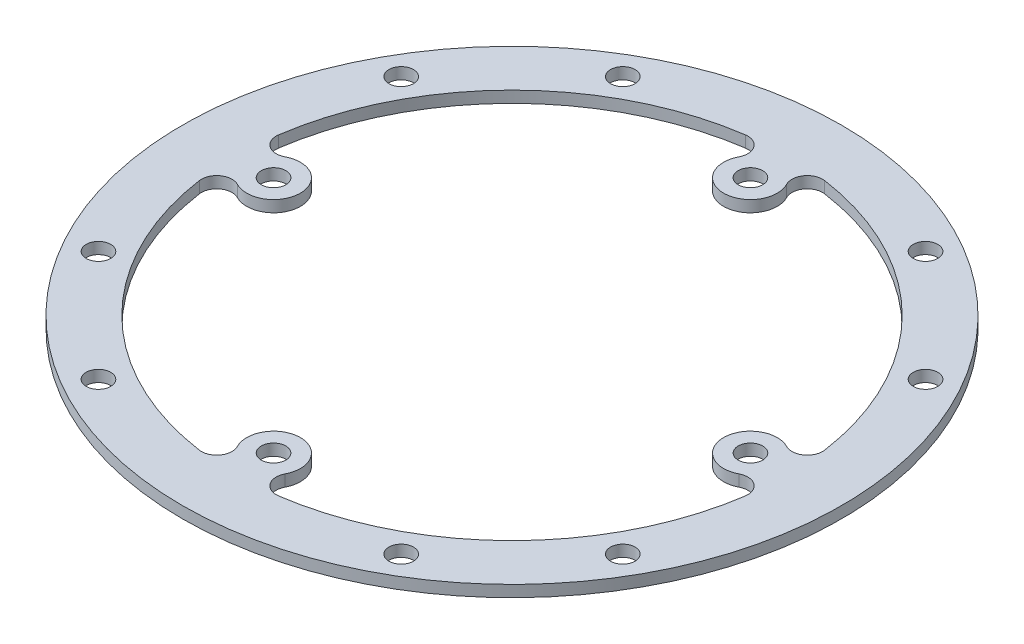
ISO-10303-21;
HEADER;
FILE_DESCRIPTION(('STEP AP214'),'2;1');
FILE_NAME('part.step','',(''),(''),'','','');
FILE_SCHEMA(('AUTOMOTIVE_DESIGN { 1 0 10303 214 1 1 1 1 }'));
ENDSEC;
DATA;
#1=APPLICATION_CONTEXT('core data for automotive mechanical design processes');
#2=APPLICATION_PROTOCOL_DEFINITION('international standard','automotive_design',2000,#1);
#3=PRODUCT_CONTEXT('',#1,'mechanical');
#4=PRODUCT('Part','Part','',(#3));
#5=PRODUCT_RELATED_PRODUCT_CATEGORY('part','',(#4));
#6=PRODUCT_DEFINITION_FORMATION('','',#4);
#7=PRODUCT_DEFINITION_CONTEXT('part definition',#1,'design');
#8=PRODUCT_DEFINITION('design','',#6,#7);
#9=PRODUCT_DEFINITION_SHAPE('','',#8);
#10=(LENGTH_UNIT() NAMED_UNIT(*) SI_UNIT(.MILLI.,.METRE.));
#11=(NAMED_UNIT(*) PLANE_ANGLE_UNIT() SI_UNIT($,.RADIAN.));
#12=(NAMED_UNIT(*) SI_UNIT($,.STERADIAN.) SOLID_ANGLE_UNIT());
#13=UNCERTAINTY_MEASURE_WITH_UNIT(LENGTH_MEASURE(1.E-05),#10,'distance_accuracy_value','');
#14=(GEOMETRIC_REPRESENTATION_CONTEXT(3) GLOBAL_UNCERTAINTY_ASSIGNED_CONTEXT((#13)) GLOBAL_UNIT_ASSIGNED_CONTEXT((#10,
#11,#12)) REPRESENTATION_CONTEXT('',''));
#15=CARTESIAN_POINT('',(0.,0.,0.));
#16=DIRECTION('',(0.,0.,1.));
#17=DIRECTION('',(1.,0.,0.));
#18=AXIS2_PLACEMENT_3D('',#15,#16,#17);
#19=CARTESIAN_POINT('',(0.,0.75,0.));
#20=DIRECTION('',(0.,-1.,0.));
#21=DIRECTION('',(0.,0.,-1.));
#22=AXIS2_PLACEMENT_3D('',#19,#20,#21);
#23=CYLINDRICAL_SURFACE('',#22,43.);
#24=CARTESIAN_POINT('',(0.,0.75,0.));
#25=DIRECTION('',(0.,1.,0.));
#26=DIRECTION('',(0.,0.,1.));
#27=AXIS2_PLACEMENT_3D('',#24,#25,#26);
#28=CIRCLE('',#27,43.);
#29=CARTESIAN_POINT('',(0.,0.75,43.));
#30=VERTEX_POINT('',#29);
#31=EDGE_CURVE('E11',#30,#30,#28,.T.);
#32=ORIENTED_EDGE('',*,*,#31,.F.);
#33=EDGE_LOOP('',(#32));
#34=FACE_BOUND('',#33,.T.);
#35=CARTESIAN_POINT('',(0.,-0.75,0.));
#36=DIRECTION('',(0.,1.,0.));
#37=DIRECTION('',(0.,0.,1.));
#38=AXIS2_PLACEMENT_3D('',#35,#36,#37);
#39=CIRCLE('',#38,43.);
#40=CARTESIAN_POINT('',(0.,-0.75,43.));
#41=VERTEX_POINT('',#40);
#42=EDGE_CURVE('E38',#41,#41,#39,.T.);
#43=ORIENTED_EDGE('',*,*,#42,.T.);
#44=EDGE_LOOP('',(#43));
#45=FACE_BOUND('',#44,.T.);
#46=ADVANCED_FACE('F35',(#34,#45),#23,.T.);
#47=CARTESIAN_POINT('',(0.,0.75,0.));
#48=DIRECTION('',(0.,1.,0.));
#49=DIRECTION('',(0.,0.,1.));
#50=AXIS2_PLACEMENT_3D('',#47,#48,#49);
#51=PLANE('',#50);
#52=CARTESIAN_POINT('',(-33.6478368888485,0.75,4.88088851557246));
#53=DIRECTION('',(0.,1.,0.));
#54=DIRECTION('',(0.,0.,1.));
#55=AXIS2_PLACEMENT_3D('',#52,#53,#54);
#56=CIRCLE('',#55,1.99999999999999);
#57=CARTESIAN_POINT('',(-32.7259683373429,0.75,3.1060199644552));
#58=VERTEX_POINT('',#57);
#59=CARTESIAN_POINT('',(-35.6271214117219,0.75,5.16799960472377));
#60=VERTEX_POINT('',#59);
#61=EDGE_CURVE('E49',#58,#60,#56,.T.);
#62=ORIENTED_EDGE('',*,*,#61,.F.);
#63=CARTESIAN_POINT('',(-31.1126983722082,0.75,0.));
#64=DIRECTION('',(0.,-1.,0.));
#65=DIRECTION('',(0.,0.,1.));
#66=AXIS2_PLACEMENT_3D('',#63,#64,#65);
#67=CIRCLE('',#66,3.5);
#68=CARTESIAN_POINT('',(-32.7259683373429,0.75,-3.1060199644552));
#69=VERTEX_POINT('',#68);
#70=EDGE_CURVE('E166',#69,#58,#67,.T.);
#71=ORIENTED_EDGE('',*,*,#70,.F.);
#72=CARTESIAN_POINT('',(-33.6478368888485,0.75,-4.88088851557246));
#73=DIRECTION('',(0.,1.,0.));
#74=DIRECTION('',(0.,0.,1.));
#75=AXIS2_PLACEMENT_3D('',#72,#73,#74);
#76=CIRCLE('',#75,2.);
#77=CARTESIAN_POINT('',(-35.6271214117219,0.75,-5.16799960472379));
#78=VERTEX_POINT('',#77);
#79=EDGE_CURVE('E169',#78,#69,#76,.T.);
#80=ORIENTED_EDGE('',*,*,#79,.F.);
#81=CARTESIAN_POINT('',(0.,0.75,0.));
#82=DIRECTION('',(0.,1.,0.));
#83=DIRECTION('',(0.,0.,1.));
#84=AXIS2_PLACEMENT_3D('',#81,#82,#83);
#85=CIRCLE('',#84,36.);
#86=CARTESIAN_POINT('',(-5.16799960472367,0.75,-35.627121411722));
#87=VERTEX_POINT('',#86);
#88=EDGE_CURVE('E245',#87,#78,#85,.T.);
#89=ORIENTED_EDGE('',*,*,#88,.F.);
#90=CARTESIAN_POINT('',(-4.88088851557246,0.75,-33.6478368888485));
#91=DIRECTION('',(0.,1.,0.));
#92=DIRECTION('',(0.,0.,1.));
#93=AXIS2_PLACEMENT_3D('',#90,#91,#92);
#94=CIRCLE('',#93,2.00000000000005);
#95=CARTESIAN_POINT('',(-3.10601996445509,0.75,-32.725968337343));
#96=VERTEX_POINT('',#95);
#97=EDGE_CURVE('E242',#96,#87,#94,.T.);
#98=ORIENTED_EDGE('',*,*,#97,.F.);
#99=CARTESIAN_POINT('',(1.08412565333123E-13,0.75,-31.1126983722083));
#100=DIRECTION('',(0.,-1.,0.));
#101=DIRECTION('',(0.,0.,1.));
#102=AXIS2_PLACEMENT_3D('',#99,#100,#101);
#103=CIRCLE('',#102,3.5);
#104=CARTESIAN_POINT('',(3.10601996445532,0.75,-32.7259683373429));
#105=VERTEX_POINT('',#104);
#106=EDGE_CURVE('E239',#105,#96,#103,.T.);
#107=ORIENTED_EDGE('',*,*,#106,.F.);
#108=CARTESIAN_POINT('',(4.88088851557258,0.75,-33.6478368888485));
#109=DIRECTION('',(0.,1.,0.));
#110=DIRECTION('',(0.,0.,1.));
#111=AXIS2_PLACEMENT_3D('',#108,#109,#110);
#112=CIRCLE('',#111,2.);
#113=CARTESIAN_POINT('',(5.16799960472391,0.75,-35.6271214117219));
#114=VERTEX_POINT('',#113);
#115=EDGE_CURVE('E236',#114,#105,#112,.T.);
#116=ORIENTED_EDGE('',*,*,#115,.F.);
#117=CARTESIAN_POINT('',(0.,0.75,0.));
#118=DIRECTION('',(0.,1.,0.));
#119=DIRECTION('',(0.,0.,1.));
#120=AXIS2_PLACEMENT_3D('',#117,#118,#119);
#121=CIRCLE('',#120,36.);
#122=CARTESIAN_POINT('',(35.627121411722,0.75,-5.16799960472353));
#123=VERTEX_POINT('',#122);
#124=EDGE_CURVE('E233',#123,#114,#121,.T.);
#125=ORIENTED_EDGE('',*,*,#124,.F.);
#126=CARTESIAN_POINT('',(33.6478368888485,0.75,-4.88088851557223));
#127=DIRECTION('',(0.,1.,0.));
#128=DIRECTION('',(0.,0.,1.));
#129=AXIS2_PLACEMENT_3D('',#126,#127,#128);
#130=CIRCLE('',#129,2.);
#131=CARTESIAN_POINT('',(32.725968337343,0.75,-3.10601996445498));
#132=VERTEX_POINT('',#131);
#133=EDGE_CURVE('E230',#132,#123,#130,.T.);
#134=ORIENTED_EDGE('',*,*,#133,.F.);
#135=CARTESIAN_POINT('',(31.1126983722082,0.75,2.17041971100743E-13));
#136=DIRECTION('',(0.,-1.,0.));
#137=DIRECTION('',(0.,0.,1.));
#138=AXIS2_PLACEMENT_3D('',#135,#136,#137);
#139=CIRCLE('',#138,3.5);
#140=CARTESIAN_POINT('',(32.7259683373429,0.75,3.10601996445543));
#141=VERTEX_POINT('',#140);
#142=EDGE_CURVE('E227',#141,#132,#139,.T.);
#143=ORIENTED_EDGE('',*,*,#142,.F.);
#144=CARTESIAN_POINT('',(33.6478368888484,0.75,4.8808885155727));
#145=DIRECTION('',(0.,1.,0.));
#146=DIRECTION('',(0.,0.,1.));
#147=AXIS2_PLACEMENT_3D('',#144,#145,#146);
#148=CIRCLE('',#147,2.);
#149=CARTESIAN_POINT('',(35.6271214117219,0.75,5.16799960472404));
#150=VERTEX_POINT('',#149);
#151=EDGE_CURVE('E224',#150,#141,#148,.T.);
#152=ORIENTED_EDGE('',*,*,#151,.F.);
#153=CARTESIAN_POINT('',(0.,0.75,0.));
#154=DIRECTION('',(0.,1.,0.));
#155=DIRECTION('',(0.,0.,1.));
#156=AXIS2_PLACEMENT_3D('',#153,#154,#155);
#157=CIRCLE('',#156,36.);
#158=CARTESIAN_POINT('',(5.16799960472341,0.75,35.627121411722));
#159=VERTEX_POINT('',#158);
#160=EDGE_CURVE('E221',#159,#150,#157,.T.);
#161=ORIENTED_EDGE('',*,*,#160,.F.);
#162=CARTESIAN_POINT('',(4.88088851557211,0.75,33.6478368888485));
#163=DIRECTION('',(0.,1.,0.));
#164=DIRECTION('',(0.,0.,1.));
#165=AXIS2_PLACEMENT_3D('',#162,#163,#164);
#166=CIRCLE('',#165,2.);
#167=CARTESIAN_POINT('',(3.10601996445486,0.75,32.725968337343));
#168=VERTEX_POINT('',#167);
#169=EDGE_CURVE('E218',#168,#159,#166,.T.);
#170=ORIENTED_EDGE('',*,*,#169,.F.);
#171=CARTESIAN_POINT('',(-3.25671376868364E-13,0.75,31.1126983722082));
#172=DIRECTION('',(0.,-1.,0.));
#173=DIRECTION('',(0.,0.,1.));
#174=AXIS2_PLACEMENT_3D('',#171,#172,#173);
#175=CIRCLE('',#174,3.5);
#176=CARTESIAN_POINT('',(-3.10601996445555,0.75,32.7259683373429));
#177=VERTEX_POINT('',#176);
#178=EDGE_CURVE('E215',#177,#168,#175,.T.);
#179=ORIENTED_EDGE('',*,*,#178,.F.);
#180=CARTESIAN_POINT('',(-4.88088851557282,0.75,33.6478368888484));
#181=DIRECTION('',(0.,1.,0.));
#182=DIRECTION('',(0.,0.,1.));
#183=AXIS2_PLACEMENT_3D('',#180,#181,#182);
#184=CIRCLE('',#183,2.);
#185=CARTESIAN_POINT('',(-5.16799960472417,0.75,35.6271214117219));
#186=VERTEX_POINT('',#185);
#187=EDGE_CURVE('E212',#186,#177,#184,.T.);
#188=ORIENTED_EDGE('',*,*,#187,.F.);
#189=CARTESIAN_POINT('',(0.,0.75,0.));
#190=DIRECTION('',(0.,1.,0.));
#191=DIRECTION('',(0.,0.,1.));
#192=AXIS2_PLACEMENT_3D('',#189,#190,#191);
#193=CIRCLE('',#192,36.);
#194=EDGE_CURVE('E210',#60,#186,#193,.T.);
#195=ORIENTED_EDGE('',*,*,#194,.F.);
#196=EDGE_LOOP('',(#62,#71,#80,#89,#98,#107,#116,#125,#134,#143,#152,#161,#170,#179,#188,#195));
#197=FACE_BOUND('',#196,.T.);
#198=CARTESIAN_POINT('',(-34.2080034494853,0.750000000000001,-19.75));
#199=DIRECTION('',(0.,1.,0.));
#200=DIRECTION('',(0.,0.,1.));
#201=AXIS2_PLACEMENT_3D('',#198,#199,#200);
#202=CIRCLE('',#201,1.59999999999999);
#203=CARTESIAN_POINT('',(-34.2080034494853,0.750000000000001,-18.15));
#204=VERTEX_POINT('',#203);
#205=EDGE_CURVE('E252',#204,#204,#202,.T.);
#206=ORIENTED_EDGE('',*,*,#205,.F.);
#207=EDGE_LOOP('',(#206));
#208=FACE_BOUND('',#207,.T.);
#209=CARTESIAN_POINT('',(-34.2080034494853,0.750000000000001,19.7500000000001));
#210=DIRECTION('',(0.,1.,0.));
#211=DIRECTION('',(0.,0.,1.));
#212=AXIS2_PLACEMENT_3D('',#209,#210,#211);
#213=CIRCLE('',#212,1.59999999999999);
#214=CARTESIAN_POINT('',(-34.2080034494853,0.750000000000001,21.35));
#215=VERTEX_POINT('',#214);
#216=EDGE_CURVE('E285',#215,#215,#213,.T.);
#217=ORIENTED_EDGE('',*,*,#216,.F.);
#218=EDGE_LOOP('',(#217));
#219=FACE_BOUND('',#218,.T.);
#220=CARTESIAN_POINT('',(-31.1126983722082,0.750000000000001,0.));
#221=DIRECTION('',(0.,1.,0.));
#222=DIRECTION('',(0.,0.,1.));
#223=AXIS2_PLACEMENT_3D('',#220,#221,#222);
#224=CIRCLE('',#223,1.59999999999999);
#225=CARTESIAN_POINT('',(-31.1126983722082,0.750000000000001,1.59999999999999));
#226=VERTEX_POINT('',#225);
#227=EDGE_CURVE('E291',#226,#226,#224,.T.);
#228=ORIENTED_EDGE('',*,*,#227,.F.);
#229=EDGE_LOOP('',(#228));
#230=FACE_BOUND('',#229,.T.);
#231=CARTESIAN_POINT('',(19.75,0.750000000000001,-34.2080034494853));
#232=DIRECTION('',(0.,1.,0.));
#233=DIRECTION('',(0.,0.,1.));
#234=AXIS2_PLACEMENT_3D('',#231,#232,#233);
#235=CIRCLE('',#234,1.59999999999999);
#236=CARTESIAN_POINT('',(19.75,0.750000000000001,-32.6080034494853));
#237=VERTEX_POINT('',#236);
#238=EDGE_CURVE('E297',#237,#237,#235,.T.);
#239=ORIENTED_EDGE('',*,*,#238,.F.);
#240=EDGE_LOOP('',(#239));
#241=FACE_BOUND('',#240,.T.);
#242=CARTESIAN_POINT('',(-19.7500000000001,0.750000000000001,-34.2080034494853));
#243=DIRECTION('',(0.,1.,0.));
#244=DIRECTION('',(0.,0.,1.));
#245=AXIS2_PLACEMENT_3D('',#242,#243,#244);
#246=CIRCLE('',#245,1.59999999999999);
#247=CARTESIAN_POINT('',(-19.7500000000001,0.750000000000001,-32.6080034494853));
#248=VERTEX_POINT('',#247);
#249=EDGE_CURVE('E303',#248,#248,#246,.T.);
#250=ORIENTED_EDGE('',*,*,#249,.F.);
#251=EDGE_LOOP('',(#250));
#252=FACE_BOUND('',#251,.T.);
#253=CARTESIAN_POINT('',(0.,0.750000000000001,-31.1126983722082));
#254=DIRECTION('',(0.,1.,0.));
#255=DIRECTION('',(0.,0.,1.));
#256=AXIS2_PLACEMENT_3D('',#253,#254,#255);
#257=CIRCLE('',#256,1.59999999999999);
#258=CARTESIAN_POINT('',(0.,0.750000000000001,-29.5126983722082));
#259=VERTEX_POINT('',#258);
#260=EDGE_CURVE('E309',#259,#259,#257,.T.);
#261=ORIENTED_EDGE('',*,*,#260,.F.);
#262=EDGE_LOOP('',(#261));
#263=FACE_BOUND('',#262,.T.);
#264=CARTESIAN_POINT('',(34.2080034494853,0.750000000000001,19.75));
#265=DIRECTION('',(0.,1.,0.));
#266=DIRECTION('',(0.,0.,1.));
#267=AXIS2_PLACEMENT_3D('',#264,#265,#266);
#268=CIRCLE('',#267,1.59999999999999);
#269=CARTESIAN_POINT('',(34.2080034494853,0.750000000000001,21.35));
#270=VERTEX_POINT('',#269);
#271=EDGE_CURVE('E315',#270,#270,#268,.T.);
#272=ORIENTED_EDGE('',*,*,#271,.F.);
#273=EDGE_LOOP('',(#272));
#274=FACE_BOUND('',#273,.T.);
#275=CARTESIAN_POINT('',(34.2080034494853,0.750000000000001,-19.7500000000001));
#276=DIRECTION('',(0.,1.,0.));
#277=DIRECTION('',(0.,0.,1.));
#278=AXIS2_PLACEMENT_3D('',#275,#276,#277);
#279=CIRCLE('',#278,1.59999999999999);
#280=CARTESIAN_POINT('',(34.2080034494853,0.750000000000001,-18.1500000000001));
#281=VERTEX_POINT('',#280);
#282=EDGE_CURVE('E321',#281,#281,#279,.T.);
#283=ORIENTED_EDGE('',*,*,#282,.F.);
#284=EDGE_LOOP('',(#283));
#285=FACE_BOUND('',#284,.T.);
#286=CARTESIAN_POINT('',(31.1126983722082,0.750000000000001,0.));
#287=DIRECTION('',(0.,1.,0.));
#288=DIRECTION('',(0.,0.,1.));
#289=AXIS2_PLACEMENT_3D('',#286,#287,#288);
#290=CIRCLE('',#289,1.59999999999998);
#291=CARTESIAN_POINT('',(31.1126983722082,0.750000000000001,1.59999999999998));
#292=VERTEX_POINT('',#291);
#293=EDGE_CURVE('E327',#292,#292,#290,.T.);
#294=ORIENTED_EDGE('',*,*,#293,.F.);
#295=EDGE_LOOP('',(#294));
#296=FACE_BOUND('',#295,.T.);
#297=CARTESIAN_POINT('',(-19.75,0.750000000000001,34.2080034494853));
#298=DIRECTION('',(0.,1.,0.));
#299=DIRECTION('',(0.,0.,1.));
#300=AXIS2_PLACEMENT_3D('',#297,#298,#299);
#301=CIRCLE('',#300,1.59999999999999);
#302=CARTESIAN_POINT('',(-19.75,0.750000000000001,35.8080034494853));
#303=VERTEX_POINT('',#302);
#304=EDGE_CURVE('E333',#303,#303,#301,.T.);
#305=ORIENTED_EDGE('',*,*,#304,.F.);
#306=EDGE_LOOP('',(#305));
#307=FACE_BOUND('',#306,.T.);
#308=CARTESIAN_POINT('',(19.7500000000001,0.750000000000001,34.2080034494853));
#309=DIRECTION('',(0.,1.,0.));
#310=DIRECTION('',(0.,0.,1.));
#311=AXIS2_PLACEMENT_3D('',#308,#309,#310);
#312=CIRCLE('',#311,1.59999999999999);
#313=CARTESIAN_POINT('',(19.7500000000001,0.750000000000001,35.8080034494853));
#314=VERTEX_POINT('',#313);
#315=EDGE_CURVE('E339',#314,#314,#312,.T.);
#316=ORIENTED_EDGE('',*,*,#315,.F.);
#317=EDGE_LOOP('',(#316));
#318=FACE_BOUND('',#317,.T.);
#319=CARTESIAN_POINT('',(0.,0.750000000000001,31.1126983722082));
#320=DIRECTION('',(0.,1.,0.));
#321=DIRECTION('',(0.,0.,1.));
#322=AXIS2_PLACEMENT_3D('',#319,#320,#321);
#323=CIRCLE('',#322,1.59999999999999);
#324=CARTESIAN_POINT('',(0.,0.750000000000001,32.7126983722082));
#325=VERTEX_POINT('',#324);
#326=EDGE_CURVE('E345',#325,#325,#323,.T.);
#327=ORIENTED_EDGE('',*,*,#326,.F.);
#328=EDGE_LOOP('',(#327));
#329=FACE_BOUND('',#328,.T.);
#330=ORIENTED_EDGE('',*,*,#31,.T.);
#331=EDGE_LOOP('',(#330));
#332=FACE_BOUND('',#331,.T.);
#333=ADVANCED_FACE('F358',(#197,#208,#219,#230,#241,#252,#263,#274,#285,#296,#307,#318,#329,
#332),#51,.T.);
#334=CARTESIAN_POINT('',(0.,-0.75,0.));
#335=DIRECTION('',(0.,1.,0.));
#336=DIRECTION('',(0.,0.,1.));
#337=AXIS2_PLACEMENT_3D('',#334,#335,#336);
#338=PLANE('',#337);
#339=CARTESIAN_POINT('',(-31.1126983722082,-0.75,0.));
#340=DIRECTION('',(0.,-1.,0.));
#341=DIRECTION('',(0.,0.,1.));
#342=AXIS2_PLACEMENT_3D('',#339,#340,#341);
#343=CIRCLE('',#342,3.5);
#344=CARTESIAN_POINT('',(-32.7259683373429,-0.75,-3.1060199644552));
#345=VERTEX_POINT('',#344);
#346=CARTESIAN_POINT('',(-32.7259683373429,-0.75,3.1060199644552));
#347=VERTEX_POINT('',#346);
#348=EDGE_CURVE('E155',#345,#347,#343,.T.);
#349=ORIENTED_EDGE('',*,*,#348,.T.);
#350=CARTESIAN_POINT('',(-33.6478368888485,-0.75,4.88088851557246));
#351=DIRECTION('',(0.,1.,0.));
#352=DIRECTION('',(0.,0.,1.));
#353=AXIS2_PLACEMENT_3D('',#350,#351,#352);
#354=CIRCLE('',#353,1.99999999999999);
#355=CARTESIAN_POINT('',(-35.6271214117219,-0.75,5.16799960472377));
#356=VERTEX_POINT('',#355);
#357=EDGE_CURVE('E149',#347,#356,#354,.T.);
#358=ORIENTED_EDGE('',*,*,#357,.T.);
#359=CARTESIAN_POINT('',(0.,-0.75,0.));
#360=DIRECTION('',(0.,1.,0.));
#361=DIRECTION('',(0.,0.,1.));
#362=AXIS2_PLACEMENT_3D('',#359,#360,#361);
#363=CIRCLE('',#362,36.);
#364=CARTESIAN_POINT('',(-5.16799960472417,-0.75,35.6271214117219));
#365=VERTEX_POINT('',#364);
#366=EDGE_CURVE('E158',#356,#365,#363,.T.);
#367=ORIENTED_EDGE('',*,*,#366,.T.);
#368=CARTESIAN_POINT('',(-4.88088851557282,-0.75,33.6478368888484));
#369=DIRECTION('',(0.,1.,0.));
#370=DIRECTION('',(0.,0.,1.));
#371=AXIS2_PLACEMENT_3D('',#368,#369,#370);
#372=CIRCLE('',#371,2.);
#373=CARTESIAN_POINT('',(-3.10601996445555,-0.75,32.7259683373429));
#374=VERTEX_POINT('',#373);
#375=EDGE_CURVE('E57',#365,#374,#372,.T.);
#376=ORIENTED_EDGE('',*,*,#375,.T.);
#377=CARTESIAN_POINT('',(-3.25671376868364E-13,-0.75,31.1126983722082));
#378=DIRECTION('',(0.,-1.,0.));
#379=DIRECTION('',(0.,0.,1.));
#380=AXIS2_PLACEMENT_3D('',#377,#378,#379);
#381=CIRCLE('',#380,3.5);
#382=CARTESIAN_POINT('',(3.10601996445486,-0.75,32.725968337343));
#383=VERTEX_POINT('',#382);
#384=EDGE_CURVE('E173',#374,#383,#381,.T.);
#385=ORIENTED_EDGE('',*,*,#384,.T.);
#386=CARTESIAN_POINT('',(4.88088851557211,-0.75,33.6478368888485));
#387=DIRECTION('',(0.,1.,0.));
#388=DIRECTION('',(0.,0.,1.));
#389=AXIS2_PLACEMENT_3D('',#386,#387,#388);
#390=CIRCLE('',#389,2.);
#391=CARTESIAN_POINT('',(5.16799960472341,-0.75,35.627121411722));
#392=VERTEX_POINT('',#391);
#393=EDGE_CURVE('E176',#383,#392,#390,.T.);
#394=ORIENTED_EDGE('',*,*,#393,.T.);
#395=CARTESIAN_POINT('',(0.,-0.75,0.));
#396=DIRECTION('',(0.,1.,0.));
#397=DIRECTION('',(0.,0.,1.));
#398=AXIS2_PLACEMENT_3D('',#395,#396,#397);
#399=CIRCLE('',#398,36.);
#400=CARTESIAN_POINT('',(35.6271214117219,-0.75,5.16799960472404));
#401=VERTEX_POINT('',#400);
#402=EDGE_CURVE('E179',#392,#401,#399,.T.);
#403=ORIENTED_EDGE('',*,*,#402,.T.);
#404=CARTESIAN_POINT('',(33.6478368888484,-0.75,4.8808885155727));
#405=DIRECTION('',(0.,1.,0.));
#406=DIRECTION('',(0.,0.,1.));
#407=AXIS2_PLACEMENT_3D('',#404,#405,#406);
#408=CIRCLE('',#407,2.);
#409=CARTESIAN_POINT('',(32.7259683373429,-0.75,3.10601996445543));
#410=VERTEX_POINT('',#409);
#411=EDGE_CURVE('E182',#401,#410,#408,.T.);
#412=ORIENTED_EDGE('',*,*,#411,.T.);
#413=CARTESIAN_POINT('',(31.1126983722082,-0.75,2.17041971100743E-13));
#414=DIRECTION('',(0.,-1.,0.));
#415=DIRECTION('',(0.,0.,1.));
#416=AXIS2_PLACEMENT_3D('',#413,#414,#415);
#417=CIRCLE('',#416,3.5);
#418=CARTESIAN_POINT('',(32.725968337343,-0.75,-3.10601996445498));
#419=VERTEX_POINT('',#418);
#420=EDGE_CURVE('E185',#410,#419,#417,.T.);
#421=ORIENTED_EDGE('',*,*,#420,.T.);
#422=CARTESIAN_POINT('',(33.6478368888485,-0.75,-4.88088851557223));
#423=DIRECTION('',(0.,1.,0.));
#424=DIRECTION('',(0.,0.,1.));
#425=AXIS2_PLACEMENT_3D('',#422,#423,#424);
#426=CIRCLE('',#425,2.);
#427=CARTESIAN_POINT('',(35.627121411722,-0.75,-5.16799960472353));
#428=VERTEX_POINT('',#427);
#429=EDGE_CURVE('E188',#419,#428,#426,.T.);
#430=ORIENTED_EDGE('',*,*,#429,.T.);
#431=CARTESIAN_POINT('',(0.,-0.75,0.));
#432=DIRECTION('',(0.,1.,0.));
#433=DIRECTION('',(0.,0.,1.));
#434=AXIS2_PLACEMENT_3D('',#431,#432,#433);
#435=CIRCLE('',#434,36.);
#436=CARTESIAN_POINT('',(5.16799960472391,-0.75,-35.6271214117219));
#437=VERTEX_POINT('',#436);
#438=EDGE_CURVE('E191',#428,#437,#435,.T.);
#439=ORIENTED_EDGE('',*,*,#438,.T.);
#440=CARTESIAN_POINT('',(4.88088851557258,-0.75,-33.6478368888485));
#441=DIRECTION('',(0.,1.,0.));
#442=DIRECTION('',(0.,0.,1.));
#443=AXIS2_PLACEMENT_3D('',#440,#441,#442);
#444=CIRCLE('',#443,2.);
#445=CARTESIAN_POINT('',(3.10601996445532,-0.75,-32.7259683373429));
#446=VERTEX_POINT('',#445);
#447=EDGE_CURVE('E194',#437,#446,#444,.T.);
#448=ORIENTED_EDGE('',*,*,#447,.T.);
#449=CARTESIAN_POINT('',(1.08412565333123E-13,-0.75,-31.1126983722083));
#450=DIRECTION('',(0.,-1.,0.));
#451=DIRECTION('',(0.,0.,1.));
#452=AXIS2_PLACEMENT_3D('',#449,#450,#451);
#453=CIRCLE('',#452,3.5);
#454=CARTESIAN_POINT('',(-3.10601996445509,-0.75,-32.725968337343));
#455=VERTEX_POINT('',#454);
#456=EDGE_CURVE('E197',#446,#455,#453,.T.);
#457=ORIENTED_EDGE('',*,*,#456,.T.);
#458=CARTESIAN_POINT('',(-4.88088851557246,-0.75,-33.6478368888485));
#459=DIRECTION('',(0.,1.,0.));
#460=DIRECTION('',(0.,0.,1.));
#461=AXIS2_PLACEMENT_3D('',#458,#459,#460);
#462=CIRCLE('',#461,2.00000000000005);
#463=CARTESIAN_POINT('',(-5.16799960472367,-0.75,-35.627121411722));
#464=VERTEX_POINT('',#463);
#465=EDGE_CURVE('E200',#455,#464,#462,.T.);
#466=ORIENTED_EDGE('',*,*,#465,.T.);
#467=CARTESIAN_POINT('',(0.,-0.75,0.));
#468=DIRECTION('',(0.,1.,0.));
#469=DIRECTION('',(0.,0.,1.));
#470=AXIS2_PLACEMENT_3D('',#467,#468,#469);
#471=CIRCLE('',#470,36.);
#472=CARTESIAN_POINT('',(-35.6271214117219,-0.75,-5.16799960472379));
#473=VERTEX_POINT('',#472);
#474=EDGE_CURVE('E203',#464,#473,#471,.T.);
#475=ORIENTED_EDGE('',*,*,#474,.T.);
#476=CARTESIAN_POINT('',(-33.6478368888485,-0.75,-4.88088851557246));
#477=DIRECTION('',(0.,1.,0.));
#478=DIRECTION('',(0.,0.,1.));
#479=AXIS2_PLACEMENT_3D('',#476,#477,#478);
#480=CIRCLE('',#479,2.);
#481=EDGE_CURVE('E206',#473,#345,#480,.T.);
#482=ORIENTED_EDGE('',*,*,#481,.T.);
#483=EDGE_LOOP('',(#349,#358,#367,#376,#385,#394,#403,#412,#421,#430,#439,#448,#457,#466,#475,#482));
#484=FACE_BOUND('',#483,.T.);
#485=CARTESIAN_POINT('',(-34.2080034494853,-0.75,-19.75));
#486=DIRECTION('',(0.,1.,0.));
#487=DIRECTION('',(0.,0.,1.));
#488=AXIS2_PLACEMENT_3D('',#485,#486,#487);
#489=CIRCLE('',#488,1.6);
#490=CARTESIAN_POINT('',(-34.2080034494853,-0.75,-18.15));
#491=VERTEX_POINT('',#490);
#492=EDGE_CURVE('E282',#491,#491,#489,.T.);
#493=ORIENTED_EDGE('',*,*,#492,.T.);
#494=EDGE_LOOP('',(#493));
#495=FACE_BOUND('',#494,.T.);
#496=CARTESIAN_POINT('',(-34.2080034494853,-0.75,19.7500000000001));
#497=DIRECTION('',(0.,1.,0.));
#498=DIRECTION('',(0.,0.,1.));
#499=AXIS2_PLACEMENT_3D('',#496,#497,#498);
#500=CIRCLE('',#499,1.6);
#501=CARTESIAN_POINT('',(-34.2080034494853,-0.75,21.3500000000001));
#502=VERTEX_POINT('',#501);
#503=EDGE_CURVE('E288',#502,#502,#500,.T.);
#504=ORIENTED_EDGE('',*,*,#503,.T.);
#505=EDGE_LOOP('',(#504));
#506=FACE_BOUND('',#505,.T.);
#507=CARTESIAN_POINT('',(-31.1126983722082,-0.75,0.));
#508=DIRECTION('',(0.,1.,0.));
#509=DIRECTION('',(0.,0.,1.));
#510=AXIS2_PLACEMENT_3D('',#507,#508,#509);
#511=CIRCLE('',#510,1.6);
#512=CARTESIAN_POINT('',(-31.1126983722082,-0.75,1.6));
#513=VERTEX_POINT('',#512);
#514=EDGE_CURVE('E294',#513,#513,#511,.T.);
#515=ORIENTED_EDGE('',*,*,#514,.T.);
#516=EDGE_LOOP('',(#515));
#517=FACE_BOUND('',#516,.T.);
#518=CARTESIAN_POINT('',(19.75,-0.75,-34.2080034494853));
#519=DIRECTION('',(0.,1.,0.));
#520=DIRECTION('',(0.,0.,1.));
#521=AXIS2_PLACEMENT_3D('',#518,#519,#520);
#522=CIRCLE('',#521,1.6);
#523=CARTESIAN_POINT('',(19.75,-0.75,-32.6080034494853));
#524=VERTEX_POINT('',#523);
#525=EDGE_CURVE('E300',#524,#524,#522,.T.);
#526=ORIENTED_EDGE('',*,*,#525,.T.);
#527=EDGE_LOOP('',(#526));
#528=FACE_BOUND('',#527,.T.);
#529=CARTESIAN_POINT('',(-19.7500000000001,-0.75,-34.2080034494853));
#530=DIRECTION('',(0.,1.,0.));
#531=DIRECTION('',(0.,0.,1.));
#532=AXIS2_PLACEMENT_3D('',#529,#530,#531);
#533=CIRCLE('',#532,1.6);
#534=CARTESIAN_POINT('',(-19.7500000000001,-0.75,-32.6080034494853));
#535=VERTEX_POINT('',#534);
#536=EDGE_CURVE('E306',#535,#535,#533,.T.);
#537=ORIENTED_EDGE('',*,*,#536,.T.);
#538=EDGE_LOOP('',(#537));
#539=FACE_BOUND('',#538,.T.);
#540=CARTESIAN_POINT('',(0.,-0.75,-31.1126983722082));
#541=DIRECTION('',(0.,1.,0.));
#542=DIRECTION('',(0.,0.,1.));
#543=AXIS2_PLACEMENT_3D('',#540,#541,#542);
#544=CIRCLE('',#543,1.6);
#545=CARTESIAN_POINT('',(0.,-0.75,-29.5126983722082));
#546=VERTEX_POINT('',#545);
#547=EDGE_CURVE('E312',#546,#546,#544,.T.);
#548=ORIENTED_EDGE('',*,*,#547,.T.);
#549=EDGE_LOOP('',(#548));
#550=FACE_BOUND('',#549,.T.);
#551=CARTESIAN_POINT('',(34.2080034494853,-0.75,19.75));
#552=DIRECTION('',(0.,1.,0.));
#553=DIRECTION('',(0.,0.,1.));
#554=AXIS2_PLACEMENT_3D('',#551,#552,#553);
#555=CIRCLE('',#554,1.6);
#556=CARTESIAN_POINT('',(34.2080034494853,-0.75,21.35));
#557=VERTEX_POINT('',#556);
#558=EDGE_CURVE('E318',#557,#557,#555,.T.);
#559=ORIENTED_EDGE('',*,*,#558,.T.);
#560=EDGE_LOOP('',(#559));
#561=FACE_BOUND('',#560,.T.);
#562=CARTESIAN_POINT('',(34.2080034494853,-0.75,-19.7500000000001));
#563=DIRECTION('',(0.,1.,0.));
#564=DIRECTION('',(0.,0.,1.));
#565=AXIS2_PLACEMENT_3D('',#562,#563,#564);
#566=CIRCLE('',#565,1.6);
#567=CARTESIAN_POINT('',(34.2080034494853,-0.75,-18.1500000000001));
#568=VERTEX_POINT('',#567);
#569=EDGE_CURVE('E324',#568,#568,#566,.T.);
#570=ORIENTED_EDGE('',*,*,#569,.T.);
#571=EDGE_LOOP('',(#570));
#572=FACE_BOUND('',#571,.T.);
#573=CARTESIAN_POINT('',(31.1126983722082,-0.75,0.));
#574=DIRECTION('',(0.,1.,0.));
#575=DIRECTION('',(0.,0.,1.));
#576=AXIS2_PLACEMENT_3D('',#573,#574,#575);
#577=CIRCLE('',#576,1.6);
#578=CARTESIAN_POINT('',(31.1126983722082,-0.75,1.59999999999999));
#579=VERTEX_POINT('',#578);
#580=EDGE_CURVE('E330',#579,#579,#577,.T.);
#581=ORIENTED_EDGE('',*,*,#580,.T.);
#582=EDGE_LOOP('',(#581));
#583=FACE_BOUND('',#582,.T.);
#584=CARTESIAN_POINT('',(-19.75,-0.75,34.2080034494853));
#585=DIRECTION('',(0.,1.,0.));
#586=DIRECTION('',(0.,0.,1.));
#587=AXIS2_PLACEMENT_3D('',#584,#585,#586);
#588=CIRCLE('',#587,1.6);
#589=CARTESIAN_POINT('',(-19.75,-0.75,35.8080034494853));
#590=VERTEX_POINT('',#589);
#591=EDGE_CURVE('E336',#590,#590,#588,.T.);
#592=ORIENTED_EDGE('',*,*,#591,.T.);
#593=EDGE_LOOP('',(#592));
#594=FACE_BOUND('',#593,.T.);
#595=CARTESIAN_POINT('',(19.7500000000001,-0.75,34.2080034494853));
#596=DIRECTION('',(0.,1.,0.));
#597=DIRECTION('',(0.,0.,1.));
#598=AXIS2_PLACEMENT_3D('',#595,#596,#597);
#599=CIRCLE('',#598,1.6);
#600=CARTESIAN_POINT('',(19.7500000000001,-0.75,35.8080034494853));
#601=VERTEX_POINT('',#600);
#602=EDGE_CURVE('E342',#601,#601,#599,.T.);
#603=ORIENTED_EDGE('',*,*,#602,.T.);
#604=EDGE_LOOP('',(#603));
#605=FACE_BOUND('',#604,.T.);
#606=CARTESIAN_POINT('',(0.,-0.75,31.1126983722082));
#607=DIRECTION('',(0.,1.,0.));
#608=DIRECTION('',(0.,0.,1.));
#609=AXIS2_PLACEMENT_3D('',#606,#607,#608);
#610=CIRCLE('',#609,1.6);
#611=CARTESIAN_POINT('',(0.,-0.75,32.7126983722082));
#612=VERTEX_POINT('',#611);
#613=EDGE_CURVE('E348',#612,#612,#610,.T.);
#614=ORIENTED_EDGE('',*,*,#613,.T.);
#615=EDGE_LOOP('',(#614));
#616=FACE_BOUND('',#615,.T.);
#617=ORIENTED_EDGE('',*,*,#42,.F.);
#618=EDGE_LOOP('',(#617));
#619=FACE_BOUND('',#618,.T.);
#620=ADVANCED_FACE('F162',(#484,#495,#506,#517,#528,#539,#550,#561,#572,#583,#594,#605,#616,
#619),#338,.F.);
#621=CARTESIAN_POINT('',(0.,0.75,31.1126983722082));
#622=DIRECTION('',(0.,1.,0.));
#623=DIRECTION('',(0.,0.,1.));
#624=AXIS2_PLACEMENT_3D('',#621,#622,#623);
#625=CYLINDRICAL_SURFACE('',#624,1.59999999999999);
#626=ORIENTED_EDGE('',*,*,#613,.F.);
#627=EDGE_LOOP('',(#626));
#628=FACE_BOUND('',#627,.T.);
#629=ORIENTED_EDGE('',*,*,#326,.T.);
#630=EDGE_LOOP('',(#629));
#631=FACE_BOUND('',#630,.T.);
#632=ADVANCED_FACE('F357',(#628,#631),#625,.F.);
#633=CARTESIAN_POINT('',(19.7500000000001,0.75,34.2080034494853));
#634=DIRECTION('',(0.,1.,0.));
#635=DIRECTION('',(0.,0.,1.));
#636=AXIS2_PLACEMENT_3D('',#633,#634,#635);
#637=CYLINDRICAL_SURFACE('',#636,1.59999999999999);
#638=ORIENTED_EDGE('',*,*,#602,.F.);
#639=EDGE_LOOP('',(#638));
#640=FACE_BOUND('',#639,.T.);
#641=ORIENTED_EDGE('',*,*,#315,.T.);
#642=EDGE_LOOP('',(#641));
#643=FACE_BOUND('',#642,.T.);
#644=ADVANCED_FACE('F363',(#640,#643),#637,.F.);
#645=CARTESIAN_POINT('',(-19.75,0.75,34.2080034494853));
#646=DIRECTION('',(0.,1.,0.));
#647=DIRECTION('',(0.,0.,1.));
#648=AXIS2_PLACEMENT_3D('',#645,#646,#647);
#649=CYLINDRICAL_SURFACE('',#648,1.59999999999999);
#650=ORIENTED_EDGE('',*,*,#591,.F.);
#651=EDGE_LOOP('',(#650));
#652=FACE_BOUND('',#651,.T.);
#653=ORIENTED_EDGE('',*,*,#304,.T.);
#654=EDGE_LOOP('',(#653));
#655=FACE_BOUND('',#654,.T.);
#656=ADVANCED_FACE('F583',(#652,#655),#649,.F.);
#657=CARTESIAN_POINT('',(31.1126983722082,0.75,0.));
#658=DIRECTION('',(0.,1.,0.));
#659=DIRECTION('',(0.,0.,1.));
#660=AXIS2_PLACEMENT_3D('',#657,#658,#659);
#661=CYLINDRICAL_SURFACE('',#660,1.59999999999999);
#662=ORIENTED_EDGE('',*,*,#580,.F.);
#663=EDGE_LOOP('',(#662));
#664=FACE_BOUND('',#663,.T.);
#665=ORIENTED_EDGE('',*,*,#293,.T.);
#666=EDGE_LOOP('',(#665));
#667=FACE_BOUND('',#666,.T.);
#668=ADVANCED_FACE('F579',(#664,#667),#661,.F.);
#669=CARTESIAN_POINT('',(34.2080034494853,0.75,-19.7500000000001));
#670=DIRECTION('',(0.,1.,0.));
#671=DIRECTION('',(0.,0.,1.));
#672=AXIS2_PLACEMENT_3D('',#669,#670,#671);
#673=CYLINDRICAL_SURFACE('',#672,1.59999999999999);
#674=ORIENTED_EDGE('',*,*,#569,.F.);
#675=EDGE_LOOP('',(#674));
#676=FACE_BOUND('',#675,.T.);
#677=ORIENTED_EDGE('',*,*,#282,.T.);
#678=EDGE_LOOP('',(#677));
#679=FACE_BOUND('',#678,.T.);
#680=ADVANCED_FACE('F575',(#676,#679),#673,.F.);
#681=CARTESIAN_POINT('',(34.2080034494853,0.75,19.75));
#682=DIRECTION('',(0.,1.,0.));
#683=DIRECTION('',(0.,0.,1.));
#684=AXIS2_PLACEMENT_3D('',#681,#682,#683);
#685=CYLINDRICAL_SURFACE('',#684,1.59999999999999);
#686=ORIENTED_EDGE('',*,*,#558,.F.);
#687=EDGE_LOOP('',(#686));
#688=FACE_BOUND('',#687,.T.);
#689=ORIENTED_EDGE('',*,*,#271,.T.);
#690=EDGE_LOOP('',(#689));
#691=FACE_BOUND('',#690,.T.);
#692=ADVANCED_FACE('F571',(#688,#691),#685,.F.);
#693=CARTESIAN_POINT('',(0.,0.75,-31.1126983722082));
#694=DIRECTION('',(0.,1.,0.));
#695=DIRECTION('',(0.,0.,1.));
#696=AXIS2_PLACEMENT_3D('',#693,#694,#695);
#697=CYLINDRICAL_SURFACE('',#696,1.59999999999999);
#698=ORIENTED_EDGE('',*,*,#547,.F.);
#699=EDGE_LOOP('',(#698));
#700=FACE_BOUND('',#699,.T.);
#701=ORIENTED_EDGE('',*,*,#260,.T.);
#702=EDGE_LOOP('',(#701));
#703=FACE_BOUND('',#702,.T.);
#704=ADVANCED_FACE('F567',(#700,#703),#697,.F.);
#705=CARTESIAN_POINT('',(-19.7500000000001,0.75,-34.2080034494853));
#706=DIRECTION('',(0.,1.,0.));
#707=DIRECTION('',(0.,0.,1.));
#708=AXIS2_PLACEMENT_3D('',#705,#706,#707);
#709=CYLINDRICAL_SURFACE('',#708,1.59999999999999);
#710=ORIENTED_EDGE('',*,*,#536,.F.);
#711=EDGE_LOOP('',(#710));
#712=FACE_BOUND('',#711,.T.);
#713=ORIENTED_EDGE('',*,*,#249,.T.);
#714=EDGE_LOOP('',(#713));
#715=FACE_BOUND('',#714,.T.);
#716=ADVANCED_FACE('F563',(#712,#715),#709,.F.);
#717=CARTESIAN_POINT('',(19.75,0.75,-34.2080034494853));
#718=DIRECTION('',(0.,1.,0.));
#719=DIRECTION('',(0.,0.,1.));
#720=AXIS2_PLACEMENT_3D('',#717,#718,#719);
#721=CYLINDRICAL_SURFACE('',#720,1.59999999999999);
#722=ORIENTED_EDGE('',*,*,#525,.F.);
#723=EDGE_LOOP('',(#722));
#724=FACE_BOUND('',#723,.T.);
#725=ORIENTED_EDGE('',*,*,#238,.T.);
#726=EDGE_LOOP('',(#725));
#727=FACE_BOUND('',#726,.T.);
#728=ADVANCED_FACE('F559',(#724,#727),#721,.F.);
#729=CARTESIAN_POINT('',(-31.1126983722082,0.75,0.));
#730=DIRECTION('',(0.,1.,0.));
#731=DIRECTION('',(0.,0.,1.));
#732=AXIS2_PLACEMENT_3D('',#729,#730,#731);
#733=CYLINDRICAL_SURFACE('',#732,1.59999999999999);
#734=ORIENTED_EDGE('',*,*,#514,.F.);
#735=EDGE_LOOP('',(#734));
#736=FACE_BOUND('',#735,.T.);
#737=ORIENTED_EDGE('',*,*,#227,.T.);
#738=EDGE_LOOP('',(#737));
#739=FACE_BOUND('',#738,.T.);
#740=ADVANCED_FACE('F555',(#736,#739),#733,.F.);
#741=CARTESIAN_POINT('',(-34.2080034494853,0.75,19.7500000000001));
#742=DIRECTION('',(0.,1.,0.));
#743=DIRECTION('',(0.,0.,1.));
#744=AXIS2_PLACEMENT_3D('',#741,#742,#743);
#745=CYLINDRICAL_SURFACE('',#744,1.59999999999999);
#746=ORIENTED_EDGE('',*,*,#503,.F.);
#747=EDGE_LOOP('',(#746));
#748=FACE_BOUND('',#747,.T.);
#749=ORIENTED_EDGE('',*,*,#216,.T.);
#750=EDGE_LOOP('',(#749));
#751=FACE_BOUND('',#750,.T.);
#752=ADVANCED_FACE('F551',(#748,#751),#745,.F.);
#753=CARTESIAN_POINT('',(-34.2080034494853,0.75,-19.75));
#754=DIRECTION('',(0.,1.,0.));
#755=DIRECTION('',(0.,0.,1.));
#756=AXIS2_PLACEMENT_3D('',#753,#754,#755);
#757=CYLINDRICAL_SURFACE('',#756,1.59999999999999);
#758=ORIENTED_EDGE('',*,*,#492,.F.);
#759=EDGE_LOOP('',(#758));
#760=FACE_BOUND('',#759,.T.);
#761=ORIENTED_EDGE('',*,*,#205,.T.);
#762=EDGE_LOOP('',(#761));
#763=FACE_BOUND('',#762,.T.);
#764=ADVANCED_FACE('F397',(#760,#763),#757,.F.);
#765=CARTESIAN_POINT('',(-33.6478368888485,-0.75,4.88088851557246));
#766=DIRECTION('',(0.,1.,0.));
#767=DIRECTION('',(0.,0.,1.));
#768=AXIS2_PLACEMENT_3D('',#765,#766,#767);
#769=CYLINDRICAL_SURFACE('',#768,1.99999999999999);
#770=ORIENTED_EDGE('',*,*,#61,.T.);
#771=DIRECTION('',(0.,1.,0.));
#772=VECTOR('',#771,1.);
#773=CARTESIAN_POINT('',(-35.6271214117219,-0.75,5.16799960472377));
#774=LINE('',#773,#772);
#775=EDGE_CURVE('E145',#356,#60,#774,.T.);
#776=ORIENTED_EDGE('',*,*,#775,.F.);
#777=ORIENTED_EDGE('',*,*,#357,.F.);
#778=DIRECTION('',(0.,1.,0.));
#779=VECTOR('',#778,1.);
#780=CARTESIAN_POINT('',(-32.7259683373429,-0.75,3.1060199644552));
#781=LINE('',#780,#779);
#782=EDGE_CURVE('E250',#347,#58,#781,.T.);
#783=ORIENTED_EDGE('',*,*,#782,.T.);
#784=EDGE_LOOP('',(#770,#776,#777,#783));
#785=FACE_BOUND('',#784,.T.);
#786=ADVANCED_FACE('F147',(#785),#769,.F.);
#787=CARTESIAN_POINT('',(-31.1126983722082,-0.75,0.));
#788=DIRECTION('',(0.,1.,0.));
#789=DIRECTION('',(0.,0.,1.));
#790=AXIS2_PLACEMENT_3D('',#787,#788,#789);
#791=CYLINDRICAL_SURFACE('',#790,3.5);
#792=ORIENTED_EDGE('',*,*,#70,.T.);
#793=ORIENTED_EDGE('',*,*,#782,.F.);
#794=ORIENTED_EDGE('',*,*,#348,.F.);
#795=DIRECTION('',(0.,1.,0.));
#796=VECTOR('',#795,1.);
#797=CARTESIAN_POINT('',(-32.7259683373429,-0.75,-3.1060199644552));
#798=LINE('',#797,#796);
#799=EDGE_CURVE('E253',#345,#69,#798,.T.);
#800=ORIENTED_EDGE('',*,*,#799,.T.);
#801=EDGE_LOOP('',(#792,#793,#794,#800));
#802=FACE_BOUND('',#801,.T.);
#803=ADVANCED_FACE('F396',(#802),#791,.T.);
#804=CARTESIAN_POINT('',(-33.6478368888485,-0.75,-4.88088851557246));
#805=DIRECTION('',(0.,1.,0.));
#806=DIRECTION('',(0.,0.,1.));
#807=AXIS2_PLACEMENT_3D('',#804,#805,#806);
#808=CYLINDRICAL_SURFACE('',#807,2.);
#809=ORIENTED_EDGE('',*,*,#79,.T.);
#810=ORIENTED_EDGE('',*,*,#799,.F.);
#811=ORIENTED_EDGE('',*,*,#481,.F.);
#812=DIRECTION('',(0.,1.,0.));
#813=VECTOR('',#812,1.);
#814=CARTESIAN_POINT('',(-35.6271214117219,-0.75,-5.16799960472379));
#815=LINE('',#814,#813);
#816=EDGE_CURVE('E255',#473,#78,#815,.T.);
#817=ORIENTED_EDGE('',*,*,#816,.T.);
#818=EDGE_LOOP('',(#809,#810,#811,#817));
#819=FACE_BOUND('',#818,.T.);
#820=ADVANCED_FACE('F408',(#819),#808,.F.);
#821=CARTESIAN_POINT('',(0.,-0.75,0.));
#822=DIRECTION('',(0.,1.,0.));
#823=DIRECTION('',(0.,0.,1.));
#824=AXIS2_PLACEMENT_3D('',#821,#822,#823);
#825=CYLINDRICAL_SURFACE('',#824,36.);
#826=ORIENTED_EDGE('',*,*,#88,.T.);
#827=ORIENTED_EDGE('',*,*,#816,.F.);
#828=ORIENTED_EDGE('',*,*,#474,.F.);
#829=DIRECTION('',(0.,1.,0.));
#830=VECTOR('',#829,1.);
#831=CARTESIAN_POINT('',(-5.16799960472367,-0.75,-35.627121411722));
#832=LINE('',#831,#830);
#833=EDGE_CURVE('E257',#464,#87,#832,.T.);
#834=ORIENTED_EDGE('',*,*,#833,.T.);
#835=EDGE_LOOP('',(#826,#827,#828,#834));
#836=FACE_BOUND('',#835,.T.);
#837=ADVANCED_FACE('F418',(#836),#825,.F.);
#838=CARTESIAN_POINT('',(-4.88088851557246,-0.75,-33.6478368888485));
#839=DIRECTION('',(0.,1.,0.));
#840=DIRECTION('',(0.,0.,1.));
#841=AXIS2_PLACEMENT_3D('',#838,#839,#840);
#842=CYLINDRICAL_SURFACE('',#841,2.00000000000005);
#843=ORIENTED_EDGE('',*,*,#97,.T.);
#844=ORIENTED_EDGE('',*,*,#833,.F.);
#845=ORIENTED_EDGE('',*,*,#465,.F.);
#846=DIRECTION('',(0.,1.,0.));
#847=VECTOR('',#846,1.);
#848=CARTESIAN_POINT('',(-3.10601996445509,-0.75,-32.725968337343));
#849=LINE('',#848,#847);
#850=EDGE_CURVE('E259',#455,#96,#849,.T.);
#851=ORIENTED_EDGE('',*,*,#850,.T.);
#852=EDGE_LOOP('',(#843,#844,#845,#851));
#853=FACE_BOUND('',#852,.T.);
#854=ADVANCED_FACE('F428',(#853),#842,.F.);
#855=CARTESIAN_POINT('',(1.08412565333123E-13,-0.75,-31.1126983722083));
#856=DIRECTION('',(0.,1.,0.));
#857=DIRECTION('',(0.,0.,1.));
#858=AXIS2_PLACEMENT_3D('',#855,#856,#857);
#859=CYLINDRICAL_SURFACE('',#858,3.5);
#860=ORIENTED_EDGE('',*,*,#106,.T.);
#861=ORIENTED_EDGE('',*,*,#850,.F.);
#862=ORIENTED_EDGE('',*,*,#456,.F.);
#863=DIRECTION('',(0.,1.,0.));
#864=VECTOR('',#863,1.);
#865=CARTESIAN_POINT('',(3.10601996445532,-0.75,-32.7259683373429));
#866=LINE('',#865,#864);
#867=EDGE_CURVE('E261',#446,#105,#866,.T.);
#868=ORIENTED_EDGE('',*,*,#867,.T.);
#869=EDGE_LOOP('',(#860,#861,#862,#868));
#870=FACE_BOUND('',#869,.T.);
#871=ADVANCED_FACE('F438',(#870),#859,.T.);
#872=CARTESIAN_POINT('',(4.88088851557258,-0.75,-33.6478368888485));
#873=DIRECTION('',(0.,1.,0.));
#874=DIRECTION('',(0.,0.,1.));
#875=AXIS2_PLACEMENT_3D('',#872,#873,#874);
#876=CYLINDRICAL_SURFACE('',#875,2.);
#877=ORIENTED_EDGE('',*,*,#115,.T.);
#878=ORIENTED_EDGE('',*,*,#867,.F.);
#879=ORIENTED_EDGE('',*,*,#447,.F.);
#880=DIRECTION('',(0.,1.,0.));
#881=VECTOR('',#880,1.);
#882=CARTESIAN_POINT('',(5.16799960472391,-0.75,-35.6271214117219));
#883=LINE('',#882,#881);
#884=EDGE_CURVE('E263',#437,#114,#883,.T.);
#885=ORIENTED_EDGE('',*,*,#884,.T.);
#886=EDGE_LOOP('',(#877,#878,#879,#885));
#887=FACE_BOUND('',#886,.T.);
#888=ADVANCED_FACE('F448',(#887),#876,.F.);
#889=CARTESIAN_POINT('',(0.,-0.75,0.));
#890=DIRECTION('',(0.,1.,0.));
#891=DIRECTION('',(0.,0.,1.));
#892=AXIS2_PLACEMENT_3D('',#889,#890,#891);
#893=CYLINDRICAL_SURFACE('',#892,36.);
#894=ORIENTED_EDGE('',*,*,#124,.T.);
#895=ORIENTED_EDGE('',*,*,#884,.F.);
#896=ORIENTED_EDGE('',*,*,#438,.F.);
#897=DIRECTION('',(0.,1.,0.));
#898=VECTOR('',#897,1.);
#899=CARTESIAN_POINT('',(35.627121411722,-0.75,-5.16799960472353));
#900=LINE('',#899,#898);
#901=EDGE_CURVE('E265',#428,#123,#900,.T.);
#902=ORIENTED_EDGE('',*,*,#901,.T.);
#903=EDGE_LOOP('',(#894,#895,#896,#902));
#904=FACE_BOUND('',#903,.T.);
#905=ADVANCED_FACE('F458',(#904),#893,.F.);
#906=CARTESIAN_POINT('',(33.6478368888485,-0.75,-4.88088851557223));
#907=DIRECTION('',(0.,1.,0.));
#908=DIRECTION('',(0.,0.,1.));
#909=AXIS2_PLACEMENT_3D('',#906,#907,#908);
#910=CYLINDRICAL_SURFACE('',#909,2.);
#911=ORIENTED_EDGE('',*,*,#133,.T.);
#912=ORIENTED_EDGE('',*,*,#901,.F.);
#913=ORIENTED_EDGE('',*,*,#429,.F.);
#914=DIRECTION('',(0.,1.,0.));
#915=VECTOR('',#914,1.);
#916=CARTESIAN_POINT('',(32.725968337343,-0.75,-3.10601996445498));
#917=LINE('',#916,#915);
#918=EDGE_CURVE('E267',#419,#132,#917,.T.);
#919=ORIENTED_EDGE('',*,*,#918,.T.);
#920=EDGE_LOOP('',(#911,#912,#913,#919));
#921=FACE_BOUND('',#920,.T.);
#922=ADVANCED_FACE('F468',(#921),#910,.F.);
#923=CARTESIAN_POINT('',(31.1126983722082,-0.75,2.17041971100743E-13));
#924=DIRECTION('',(0.,1.,0.));
#925=DIRECTION('',(0.,0.,1.));
#926=AXIS2_PLACEMENT_3D('',#923,#924,#925);
#927=CYLINDRICAL_SURFACE('',#926,3.5);
#928=ORIENTED_EDGE('',*,*,#142,.T.);
#929=ORIENTED_EDGE('',*,*,#918,.F.);
#930=ORIENTED_EDGE('',*,*,#420,.F.);
#931=DIRECTION('',(0.,1.,0.));
#932=VECTOR('',#931,1.);
#933=CARTESIAN_POINT('',(32.7259683373429,-0.75,3.10601996445543));
#934=LINE('',#933,#932);
#935=EDGE_CURVE('E269',#410,#141,#934,.T.);
#936=ORIENTED_EDGE('',*,*,#935,.T.);
#937=EDGE_LOOP('',(#928,#929,#930,#936));
#938=FACE_BOUND('',#937,.T.);
#939=ADVANCED_FACE('F478',(#938),#927,.T.);
#940=CARTESIAN_POINT('',(33.6478368888484,-0.75,4.8808885155727));
#941=DIRECTION('',(0.,1.,0.));
#942=DIRECTION('',(0.,0.,1.));
#943=AXIS2_PLACEMENT_3D('',#940,#941,#942);
#944=CYLINDRICAL_SURFACE('',#943,2.);
#945=ORIENTED_EDGE('',*,*,#151,.T.);
#946=ORIENTED_EDGE('',*,*,#935,.F.);
#947=ORIENTED_EDGE('',*,*,#411,.F.);
#948=DIRECTION('',(0.,1.,0.));
#949=VECTOR('',#948,1.);
#950=CARTESIAN_POINT('',(35.6271214117219,-0.75,5.16799960472404));
#951=LINE('',#950,#949);
#952=EDGE_CURVE('E271',#401,#150,#951,.T.);
#953=ORIENTED_EDGE('',*,*,#952,.T.);
#954=EDGE_LOOP('',(#945,#946,#947,#953));
#955=FACE_BOUND('',#954,.T.);
#956=ADVANCED_FACE('F488',(#955),#944,.F.);
#957=CARTESIAN_POINT('',(0.,-0.75,0.));
#958=DIRECTION('',(0.,1.,0.));
#959=DIRECTION('',(0.,0.,1.));
#960=AXIS2_PLACEMENT_3D('',#957,#958,#959);
#961=CYLINDRICAL_SURFACE('',#960,36.);
#962=ORIENTED_EDGE('',*,*,#160,.T.);
#963=ORIENTED_EDGE('',*,*,#952,.F.);
#964=ORIENTED_EDGE('',*,*,#402,.F.);
#965=DIRECTION('',(0.,1.,0.));
#966=VECTOR('',#965,1.);
#967=CARTESIAN_POINT('',(5.16799960472341,-0.75,35.627121411722));
#968=LINE('',#967,#966);
#969=EDGE_CURVE('E273',#392,#159,#968,.T.);
#970=ORIENTED_EDGE('',*,*,#969,.T.);
#971=EDGE_LOOP('',(#962,#963,#964,#970));
#972=FACE_BOUND('',#971,.T.);
#973=ADVANCED_FACE('F498',(#972),#961,.F.);
#974=CARTESIAN_POINT('',(4.88088851557211,-0.75,33.6478368888485));
#975=DIRECTION('',(0.,1.,0.));
#976=DIRECTION('',(0.,0.,1.));
#977=AXIS2_PLACEMENT_3D('',#974,#975,#976);
#978=CYLINDRICAL_SURFACE('',#977,2.);
#979=ORIENTED_EDGE('',*,*,#169,.T.);
#980=ORIENTED_EDGE('',*,*,#969,.F.);
#981=ORIENTED_EDGE('',*,*,#393,.F.);
#982=DIRECTION('',(0.,1.,0.));
#983=VECTOR('',#982,1.);
#984=CARTESIAN_POINT('',(3.10601996445486,-0.75,32.725968337343));
#985=LINE('',#984,#983);
#986=EDGE_CURVE('E275',#383,#168,#985,.T.);
#987=ORIENTED_EDGE('',*,*,#986,.T.);
#988=EDGE_LOOP('',(#979,#980,#981,#987));
#989=FACE_BOUND('',#988,.T.);
#990=ADVANCED_FACE('F508',(#989),#978,.F.);
#991=CARTESIAN_POINT('',(-3.25671376868364E-13,-0.75,31.1126983722082));
#992=DIRECTION('',(0.,1.,0.));
#993=DIRECTION('',(0.,0.,1.));
#994=AXIS2_PLACEMENT_3D('',#991,#992,#993);
#995=CYLINDRICAL_SURFACE('',#994,3.5);
#996=ORIENTED_EDGE('',*,*,#178,.T.);
#997=ORIENTED_EDGE('',*,*,#986,.F.);
#998=ORIENTED_EDGE('',*,*,#384,.F.);
#999=DIRECTION('',(0.,1.,0.));
#1000=VECTOR('',#999,1.);
#1001=CARTESIAN_POINT('',(-3.10601996445555,-0.75,32.7259683373429));
#1002=LINE('',#1001,#1000);
#1003=EDGE_CURVE('E277',#374,#177,#1002,.T.);
#1004=ORIENTED_EDGE('',*,*,#1003,.T.);
#1005=EDGE_LOOP('',(#996,#997,#998,#1004));
#1006=FACE_BOUND('',#1005,.T.);
#1007=ADVANCED_FACE('F518',(#1006),#995,.T.);
#1008=CARTESIAN_POINT('',(-4.88088851557282,-0.75,33.6478368888484));
#1009=DIRECTION('',(0.,1.,0.));
#1010=DIRECTION('',(0.,0.,1.));
#1011=AXIS2_PLACEMENT_3D('',#1008,#1009,#1010);
#1012=CYLINDRICAL_SURFACE('',#1011,2.);
#1013=ORIENTED_EDGE('',*,*,#187,.T.);
#1014=ORIENTED_EDGE('',*,*,#1003,.F.);
#1015=ORIENTED_EDGE('',*,*,#375,.F.);
#1016=DIRECTION('',(0.,1.,0.));
#1017=VECTOR('',#1016,1.);
#1018=CARTESIAN_POINT('',(-5.16799960472417,-0.75,35.6271214117219));
#1019=LINE('',#1018,#1017);
#1020=EDGE_CURVE('E154',#365,#186,#1019,.T.);
#1021=ORIENTED_EDGE('',*,*,#1020,.T.);
#1022=EDGE_LOOP('',(#1013,#1014,#1015,#1021));
#1023=FACE_BOUND('',#1022,.T.);
#1024=ADVANCED_FACE('F528',(#1023),#1012,.F.);
#1025=CARTESIAN_POINT('',(0.,-0.75,0.));
#1026=DIRECTION('',(0.,1.,0.));
#1027=DIRECTION('',(0.,0.,1.));
#1028=AXIS2_PLACEMENT_3D('',#1025,#1026,#1027);
#1029=CYLINDRICAL_SURFACE('',#1028,36.);
#1030=ORIENTED_EDGE('',*,*,#194,.T.);
#1031=ORIENTED_EDGE('',*,*,#1020,.F.);
#1032=ORIENTED_EDGE('',*,*,#366,.F.);
#1033=ORIENTED_EDGE('',*,*,#775,.T.);
#1034=EDGE_LOOP('',(#1030,#1031,#1032,#1033));
#1035=FACE_BOUND('',#1034,.T.);
#1036=ADVANCED_FACE('F159',(#1035),#1029,.F.);
#1037=CLOSED_SHELL('',(#46,#333,#620,#632,#644,#656,#668,#680,#692,#704,#716,#728,#740,#752,
#764,#786,#803,#820,#837,#854,#871,#888,#905,#922,#939,#956,#973,#990,#1007,#1024,#1036));
#1038=MANIFOLD_SOLID_BREP('B2',#1037);
#1039=ADVANCED_BREP_SHAPE_REPRESENTATION('',(#18,#1038),#14);
#1040=SHAPE_DEFINITION_REPRESENTATION(#9,#1039);
ENDSEC;
END-ISO-10303-21;
